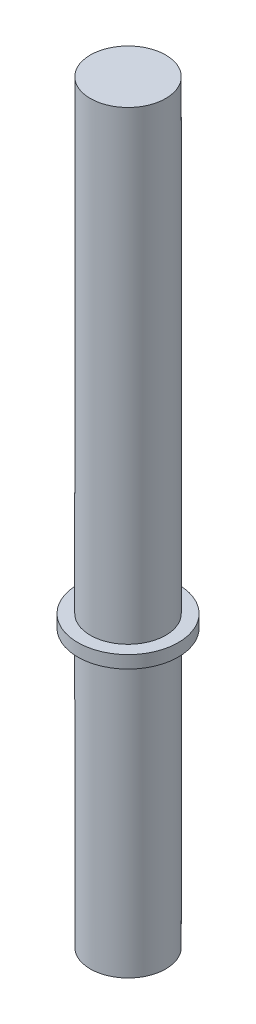
ISO-10303-21;
HEADER;
FILE_DESCRIPTION(('STEP AP214'),'2;1');
FILE_NAME('part.step','',(''),(''),'','','');
FILE_SCHEMA(('AUTOMOTIVE_DESIGN { 1 0 10303 214 1 1 1 1 }'));
ENDSEC;
DATA;
#1=APPLICATION_CONTEXT('core data for automotive mechanical design processes');
#2=APPLICATION_PROTOCOL_DEFINITION('international standard','automotive_design',2000,#1);
#3=PRODUCT_CONTEXT('',#1,'mechanical');
#4=PRODUCT('Part','Part','',(#3));
#5=PRODUCT_RELATED_PRODUCT_CATEGORY('part','',(#4));
#6=PRODUCT_DEFINITION_FORMATION('','',#4);
#7=PRODUCT_DEFINITION_CONTEXT('part definition',#1,'design');
#8=PRODUCT_DEFINITION('design','',#6,#7);
#9=PRODUCT_DEFINITION_SHAPE('','',#8);
#10=(LENGTH_UNIT() NAMED_UNIT(*) SI_UNIT(.MILLI.,.METRE.));
#11=(NAMED_UNIT(*) PLANE_ANGLE_UNIT() SI_UNIT($,.RADIAN.));
#12=(NAMED_UNIT(*) SI_UNIT($,.STERADIAN.) SOLID_ANGLE_UNIT());
#13=UNCERTAINTY_MEASURE_WITH_UNIT(LENGTH_MEASURE(1.E-05),#10,'distance_accuracy_value','');
#14=(GEOMETRIC_REPRESENTATION_CONTEXT(3) GLOBAL_UNCERTAINTY_ASSIGNED_CONTEXT((#13)) GLOBAL_UNIT_ASSIGNED_CONTEXT((#10,
#11,#12)) REPRESENTATION_CONTEXT('',''));
#15=CARTESIAN_POINT('',(0.,0.,0.));
#16=DIRECTION('',(0.,0.,1.));
#17=DIRECTION('',(1.,0.,0.));
#18=AXIS2_PLACEMENT_3D('',#15,#16,#17);
#19=CARTESIAN_POINT('',(0.,30.,0.));
#20=DIRECTION('',(0.,-1.,0.));
#21=DIRECTION('',(0.,0.,-1.));
#22=AXIS2_PLACEMENT_3D('',#19,#20,#21);
#23=CYLINDRICAL_SURFACE('',#22,1.5);
#24=CARTESIAN_POINT('',(0.,30.,0.));
#25=DIRECTION('',(0.,1.,0.));
#26=DIRECTION('',(0.,0.,1.));
#27=AXIS2_PLACEMENT_3D('',#24,#25,#26);
#28=CIRCLE('',#27,1.5);
#29=CARTESIAN_POINT('',(0.,30.,1.5));
#30=VERTEX_POINT('',#29);
#31=EDGE_CURVE('E40',#30,#30,#28,.T.);
#32=ORIENTED_EDGE('',*,*,#31,.F.);
#33=EDGE_LOOP('',(#32));
#34=FACE_BOUND('',#33,.T.);
#35=CARTESIAN_POINT('',(0.,11.5,0.));
#36=DIRECTION('',(0.,-1.,0.));
#37=DIRECTION('',(0.,0.,-1.));
#38=AXIS2_PLACEMENT_3D('',#35,#36,#37);
#39=CIRCLE('',#38,1.5);
#40=CARTESIAN_POINT('',(0.,11.5,-1.5));
#41=VERTEX_POINT('',#40);
#42=EDGE_CURVE('E10',#41,#41,#39,.T.);
#43=ORIENTED_EDGE('',*,*,#42,.F.);
#44=EDGE_LOOP('',(#43));
#45=FACE_BOUND('',#44,.T.);
#46=ADVANCED_FACE('F33',(#34,#45),#23,.T.);
#47=CARTESIAN_POINT('',(0.,30.,0.));
#48=DIRECTION('',(0.,1.,0.));
#49=DIRECTION('',(0.,0.,1.));
#50=AXIS2_PLACEMENT_3D('',#47,#48,#49);
#51=PLANE('',#50);
#52=ORIENTED_EDGE('',*,*,#31,.T.);
#53=EDGE_LOOP('',(#52));
#54=FACE_BOUND('',#53,.T.);
#55=ADVANCED_FACE('F72',(#54),#51,.T.);
#56=CARTESIAN_POINT('',(0.,11.5,0.));
#57=DIRECTION('',(0.,-1.,0.));
#58=DIRECTION('',(0.,0.,-1.));
#59=AXIS2_PLACEMENT_3D('',#56,#57,#58);
#60=CYLINDRICAL_SURFACE('',#59,2.);
#61=CARTESIAN_POINT('',(0.,11.5,0.));
#62=DIRECTION('',(0.,-1.,0.));
#63=DIRECTION('',(0.,0.,-1.));
#64=AXIS2_PLACEMENT_3D('',#61,#62,#63);
#65=CIRCLE('',#64,2.);
#66=CARTESIAN_POINT('',(0.,11.5,-2.));
#67=VERTEX_POINT('',#66);
#68=EDGE_CURVE('E49',#67,#67,#65,.T.);
#69=ORIENTED_EDGE('',*,*,#68,.T.);
#70=EDGE_LOOP('',(#69));
#71=FACE_BOUND('',#70,.T.);
#72=CARTESIAN_POINT('',(0.,11.,0.));
#73=DIRECTION('',(0.,-1.,0.));
#74=DIRECTION('',(0.,0.,-1.));
#75=AXIS2_PLACEMENT_3D('',#72,#73,#74);
#76=CIRCLE('',#75,2.);
#77=CARTESIAN_POINT('',(0.,11.,-2.));
#78=VERTEX_POINT('',#77);
#79=EDGE_CURVE('E51',#78,#78,#76,.T.);
#80=ORIENTED_EDGE('',*,*,#79,.F.);
#81=EDGE_LOOP('',(#80));
#82=FACE_BOUND('',#81,.T.);
#83=ADVANCED_FACE('F70',(#71,#82),#60,.T.);
#84=CARTESIAN_POINT('',(0.,11.5,0.));
#85=DIRECTION('',(0.,-1.,0.));
#86=DIRECTION('',(0.,0.,-1.));
#87=AXIS2_PLACEMENT_3D('',#84,#85,#86);
#88=PLANE('',#87);
#89=ORIENTED_EDGE('',*,*,#42,.T.);
#90=EDGE_LOOP('',(#89));
#91=FACE_BOUND('',#90,.T.);
#92=ORIENTED_EDGE('',*,*,#68,.F.);
#93=EDGE_LOOP('',(#92));
#94=FACE_BOUND('',#93,.T.);
#95=ADVANCED_FACE('F66',(#91,#94),#88,.F.);
#96=CARTESIAN_POINT('',(0.,11.,0.));
#97=DIRECTION('',(0.,-1.,0.));
#98=DIRECTION('',(0.,0.,-1.));
#99=AXIS2_PLACEMENT_3D('',#96,#97,#98);
#100=PLANE('',#99);
#101=CARTESIAN_POINT('',(0.,11.,0.));
#102=DIRECTION('',(0.,-1.,0.));
#103=DIRECTION('',(0.,0.,-1.));
#104=AXIS2_PLACEMENT_3D('',#101,#102,#103);
#105=CIRCLE('',#104,1.5);
#106=CARTESIAN_POINT('',(0.,11.,-1.5));
#107=VERTEX_POINT('',#106);
#108=EDGE_CURVE('E54',#107,#107,#105,.T.);
#109=ORIENTED_EDGE('',*,*,#108,.F.);
#110=EDGE_LOOP('',(#109));
#111=FACE_BOUND('',#110,.T.);
#112=ORIENTED_EDGE('',*,*,#79,.T.);
#113=EDGE_LOOP('',(#112));
#114=FACE_BOUND('',#113,.T.);
#115=ADVANCED_FACE('F62',(#111,#114),#100,.T.);
#116=CARTESIAN_POINT('',(0.,0.,0.));
#117=DIRECTION('',(0.,1.,0.));
#118=DIRECTION('',(0.,0.,1.));
#119=AXIS2_PLACEMENT_3D('',#116,#117,#118);
#120=PLANE('',#119);
#121=CARTESIAN_POINT('',(0.,0.,0.));
#122=DIRECTION('',(0.,1.,0.));
#123=DIRECTION('',(0.,0.,1.));
#124=AXIS2_PLACEMENT_3D('',#121,#122,#123);
#125=CIRCLE('',#124,1.5);
#126=CARTESIAN_POINT('',(0.,0.,1.5));
#127=VERTEX_POINT('',#126);
#128=EDGE_CURVE('E44',#127,#127,#125,.T.);
#129=ORIENTED_EDGE('',*,*,#128,.F.);
#130=EDGE_LOOP('',(#129));
#131=FACE_BOUND('',#130,.T.);
#132=ADVANCED_FACE('F65',(#131),#120,.F.);
#133=ORIENTED_EDGE('',*,*,#108,.T.);
#134=EDGE_LOOP('',(#133));
#135=FACE_BOUND('',#134,.T.);
#136=ORIENTED_EDGE('',*,*,#128,.T.);
#137=EDGE_LOOP('',(#136));
#138=FACE_BOUND('',#137,.T.);
#139=ADVANCED_FACE('F35',(#135,#138),#23,.T.);
#140=CLOSED_SHELL('',(#46,#55,#83,#95,#115,#132,#139));
#141=MANIFOLD_SOLID_BREP('B2',#140);
#142=ADVANCED_BREP_SHAPE_REPRESENTATION('',(#18,#141),#14);
#143=SHAPE_DEFINITION_REPRESENTATION(#9,#142);
ENDSEC;
END-ISO-10303-21;
